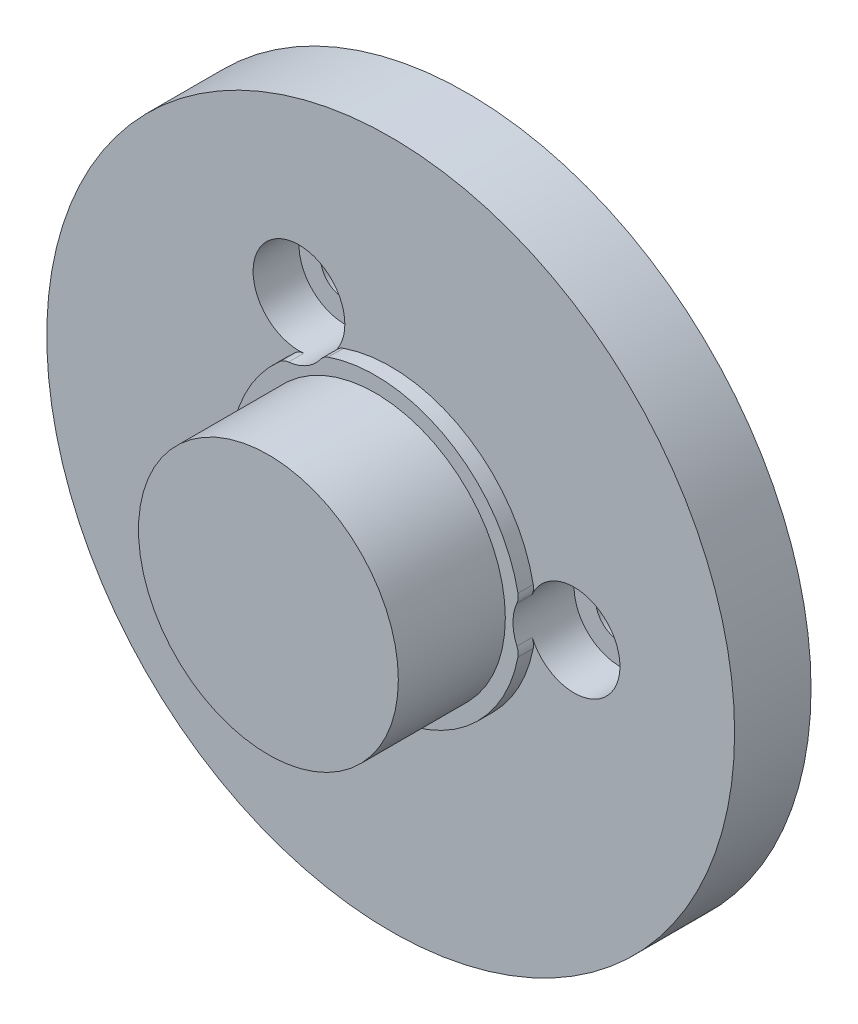
ISO-10303-21;
HEADER;
FILE_DESCRIPTION(('STEP AP214'),'2;1');
FILE_NAME('part.step','',(''),(''),'','','');
FILE_SCHEMA(('AUTOMOTIVE_DESIGN { 1 0 10303 214 1 1 1 1 }'));
ENDSEC;
DATA;
#1=APPLICATION_CONTEXT('core data for automotive mechanical design processes');
#2=APPLICATION_PROTOCOL_DEFINITION('international standard','automotive_design',2000,#1);
#3=PRODUCT_CONTEXT('',#1,'mechanical');
#4=PRODUCT('Part','Part','',(#3));
#5=PRODUCT_RELATED_PRODUCT_CATEGORY('part','',(#4));
#6=PRODUCT_DEFINITION_FORMATION('','',#4);
#7=PRODUCT_DEFINITION_CONTEXT('part definition',#1,'design');
#8=PRODUCT_DEFINITION('design','',#6,#7);
#9=PRODUCT_DEFINITION_SHAPE('','',#8);
#10=(LENGTH_UNIT() NAMED_UNIT(*) SI_UNIT(.MILLI.,.METRE.));
#11=(NAMED_UNIT(*) PLANE_ANGLE_UNIT() SI_UNIT($,.RADIAN.));
#12=(NAMED_UNIT(*) SI_UNIT($,.STERADIAN.) SOLID_ANGLE_UNIT());
#13=UNCERTAINTY_MEASURE_WITH_UNIT(LENGTH_MEASURE(1.E-05),#10,'distance_accuracy_value','');
#14=(GEOMETRIC_REPRESENTATION_CONTEXT(3) GLOBAL_UNCERTAINTY_ASSIGNED_CONTEXT((#13)) GLOBAL_UNIT_ASSIGNED_CONTEXT((#10,
#11,#12)) REPRESENTATION_CONTEXT('',''));
#15=CARTESIAN_POINT('',(0.,0.,0.));
#16=DIRECTION('',(0.,0.,1.));
#17=DIRECTION('',(1.,0.,0.));
#18=AXIS2_PLACEMENT_3D('',#15,#16,#17);
#19=CARTESIAN_POINT('',(-6.00000000000001,10.3923048454133,36.));
#20=DIRECTION('',(0.,0.,-1.));
#21=DIRECTION('',(-1.,0.,0.));
#22=AXIS2_PLACEMENT_3D('',#19,#20,#21);
#23=CYLINDRICAL_SURFACE('',#22,1.6);
#24=CARTESIAN_POINT('',(-6.00000000000001,10.3923048454133,31.));
#25=DIRECTION('',(0.,0.,1.));
#26=DIRECTION('',(1.,0.,0.));
#27=AXIS2_PLACEMENT_3D('',#24,#25,#26);
#28=CIRCLE('',#27,1.6);
#29=CARTESIAN_POINT('',(-4.40000000000001,10.3923048454133,31.));
#30=VERTEX_POINT('',#29);
#31=EDGE_CURVE('E260',#30,#30,#28,.T.);
#32=ORIENTED_EDGE('',*,*,#31,.F.);
#33=EDGE_LOOP('',(#32));
#34=FACE_BOUND('',#33,.T.);
#35=CARTESIAN_POINT('',(-6.00000000000001,10.3923048454133,33.));
#36=DIRECTION('',(0.,0.,1.));
#37=DIRECTION('',(1.,0.,0.));
#38=AXIS2_PLACEMENT_3D('',#35,#36,#37);
#39=CIRCLE('',#38,1.6);
#40=CARTESIAN_POINT('',(-4.40000000000001,10.3923048454133,33.));
#41=VERTEX_POINT('',#40);
#42=EDGE_CURVE('E245',#41,#41,#39,.T.);
#43=ORIENTED_EDGE('',*,*,#42,.T.);
#44=EDGE_LOOP('',(#43));
#45=FACE_BOUND('',#44,.T.);
#46=ADVANCED_FACE('F41',(#34,#45),#23,.F.);
#47=CARTESIAN_POINT('',(-6.,-10.3923048454133,36.));
#48=DIRECTION('',(0.,0.,-1.));
#49=DIRECTION('',(-1.,0.,0.));
#50=AXIS2_PLACEMENT_3D('',#47,#48,#49);
#51=CYLINDRICAL_SURFACE('',#50,1.6);
#52=CARTESIAN_POINT('',(-6.,-10.3923048454133,31.));
#53=DIRECTION('',(0.,0.,1.));
#54=DIRECTION('',(1.,0.,0.));
#55=AXIS2_PLACEMENT_3D('',#52,#53,#54);
#56=CIRCLE('',#55,1.6);
#57=CARTESIAN_POINT('',(-4.4,-10.3923048454133,31.));
#58=VERTEX_POINT('',#57);
#59=EDGE_CURVE('E265',#58,#58,#56,.T.);
#60=ORIENTED_EDGE('',*,*,#59,.F.);
#61=EDGE_LOOP('',(#60));
#62=FACE_BOUND('',#61,.T.);
#63=CARTESIAN_POINT('',(-6.,-10.3923048454133,33.));
#64=DIRECTION('',(0.,0.,1.));
#65=DIRECTION('',(1.,0.,0.));
#66=AXIS2_PLACEMENT_3D('',#63,#64,#65);
#67=CIRCLE('',#66,1.6);
#68=CARTESIAN_POINT('',(-4.4,-10.3923048454133,33.));
#69=VERTEX_POINT('',#68);
#70=EDGE_CURVE('E249',#69,#69,#67,.T.);
#71=ORIENTED_EDGE('',*,*,#70,.T.);
#72=EDGE_LOOP('',(#71));
#73=FACE_BOUND('',#72,.T.);
#74=ADVANCED_FACE('F300',(#62,#73),#51,.F.);
#75=CARTESIAN_POINT('',(12.,0.,36.));
#76=DIRECTION('',(0.,0.,-1.));
#77=DIRECTION('',(-1.,0.,0.));
#78=AXIS2_PLACEMENT_3D('',#75,#76,#77);
#79=CYLINDRICAL_SURFACE('',#78,1.6);
#80=CARTESIAN_POINT('',(12.,0.,31.));
#81=DIRECTION('',(0.,0.,1.));
#82=DIRECTION('',(1.,0.,0.));
#83=AXIS2_PLACEMENT_3D('',#80,#81,#82);
#84=CIRCLE('',#83,1.6);
#85=CARTESIAN_POINT('',(13.6,0.,31.));
#86=VERTEX_POINT('',#85);
#87=EDGE_CURVE('E248',#86,#86,#84,.T.);
#88=ORIENTED_EDGE('',*,*,#87,.F.);
#89=EDGE_LOOP('',(#88));
#90=FACE_BOUND('',#89,.T.);
#91=CARTESIAN_POINT('',(12.,0.,33.));
#92=DIRECTION('',(0.,0.,1.));
#93=DIRECTION('',(1.,0.,0.));
#94=AXIS2_PLACEMENT_3D('',#91,#92,#93);
#95=CIRCLE('',#94,1.6);
#96=CARTESIAN_POINT('',(13.6,0.,33.));
#97=VERTEX_POINT('',#96);
#98=EDGE_CURVE('E252',#97,#97,#95,.T.);
#99=ORIENTED_EDGE('',*,*,#98,.T.);
#100=EDGE_LOOP('',(#99));
#101=FACE_BOUND('',#100,.T.);
#102=ADVANCED_FACE('F307',(#90,#101),#79,.F.);
#103=CARTESIAN_POINT('',(0.,0.,36.));
#104=DIRECTION('',(0.,0.,1.));
#105=DIRECTION('',(1.,0.,0.));
#106=AXIS2_PLACEMENT_3D('',#103,#104,#105);
#107=PLANE('',#106);
#108=CARTESIAN_POINT('',(0.,0.,36.));
#109=DIRECTION('',(0.,0.,1.));
#110=DIRECTION('',(1.,0.,0.));
#111=AXIS2_PLACEMENT_3D('',#108,#109,#110);
#112=CIRCLE('',#111,9.5);
#113=CARTESIAN_POINT('',(-3.09244859102715,-8.98258101615868,36.));
#114=VERTEX_POINT('',#113);
#115=CARTESIAN_POINT('',(9.32536764705882,-1.81315146835243,36.));
#116=VERTEX_POINT('',#115);
#117=EDGE_CURVE('E155',#114,#116,#112,.T.);
#118=ORIENTED_EDGE('',*,*,#117,.F.);
#119=CARTESIAN_POINT('',(-2.7669276867085,-8.0370461723525,36.));
#120=DIRECTION('',(0.,0.,1.));
#121=DIRECTION('',(1.,0.,0.));
#122=AXIS2_PLACEMENT_3D('',#119,#120,#121);
#123=CIRCLE('',#122,1.);
#124=CARTESIAN_POINT('',(-3.57519576503138,-8.62586084061769,36.));
#125=VERTEX_POINT('',#124);
#126=EDGE_CURVE('E227',#114,#125,#123,.F.);
#127=ORIENTED_EDGE('',*,*,#126,.T.);
#128=CARTESIAN_POINT('',(-6.,-10.3923048454133,36.));
#129=DIRECTION('',(0.,0.,1.));
#130=DIRECTION('',(1.,0.,0.));
#131=AXIS2_PLACEMENT_3D('',#128,#129,#130);
#132=CIRCLE('',#131,3.);
#133=CARTESIAN_POINT('',(-5.68261673496862,-7.40914077632856,36.));
#134=VERTEX_POINT('',#133);
#135=EDGE_CURVE('E272',#134,#125,#132,.T.);
#136=ORIENTED_EDGE('',*,*,#135,.F.);
#137=CARTESIAN_POINT('',(-5.57682231329149,-6.41475275330032,36.));
#138=DIRECTION('',(0.,0.,1.));
#139=DIRECTION('',(1.,0.,0.));
#140=AXIS2_PLACEMENT_3D('',#137,#138,#139);
#141=CIRCLE('',#140,1.);
#142=CARTESIAN_POINT('',(-6.23291905603167,-7.16942954780624,36.));
#143=VERTEX_POINT('',#142);
#144=EDGE_CURVE('E225',#134,#143,#141,.F.);
#145=ORIENTED_EDGE('',*,*,#144,.T.);
#146=CARTESIAN_POINT('',(-6.23291905603168,7.16942954780624,36.));
#147=VERTEX_POINT('',#146);
#148=EDGE_CURVE('E152',#147,#143,#112,.T.);
#149=ORIENTED_EDGE('',*,*,#148,.F.);
#150=CARTESIAN_POINT('',(-5.5768223132915,6.41475275330032,36.));
#151=DIRECTION('',(0.,0.,1.));
#152=DIRECTION('',(1.,0.,0.));
#153=AXIS2_PLACEMENT_3D('',#150,#151,#152);
#154=CIRCLE('',#153,1.);
#155=CARTESIAN_POINT('',(-5.68261673496863,7.40914077632856,36.));
#156=VERTEX_POINT('',#155);
#157=EDGE_CURVE('E49',#147,#156,#154,.F.);
#158=ORIENTED_EDGE('',*,*,#157,.T.);
#159=CARTESIAN_POINT('',(-6.00000000000001,10.3923048454133,36.));
#160=DIRECTION('',(0.,0.,1.));
#161=DIRECTION('',(1.,0.,0.));
#162=AXIS2_PLACEMENT_3D('',#159,#160,#161);
#163=CIRCLE('',#162,3.);
#164=CARTESIAN_POINT('',(-3.57519576503138,8.62586084061769,36.));
#165=VERTEX_POINT('',#164);
#166=EDGE_CURVE('E56',#165,#156,#163,.T.);
#167=ORIENTED_EDGE('',*,*,#166,.F.);
#168=CARTESIAN_POINT('',(-2.76692768670851,8.0370461723525,36.));
#169=DIRECTION('',(0.,0.,1.));
#170=DIRECTION('',(1.,0.,0.));
#171=AXIS2_PLACEMENT_3D('',#168,#169,#170);
#172=CIRCLE('',#171,1.);
#173=CARTESIAN_POINT('',(-3.09244859102716,8.98258101615867,36.));
#174=VERTEX_POINT('',#173);
#175=EDGE_CURVE('E11',#165,#174,#172,.F.);
#176=ORIENTED_EDGE('',*,*,#175,.T.);
#177=CARTESIAN_POINT('',(9.32536764705882,1.81315146835243,36.));
#178=VERTEX_POINT('',#177);
#179=EDGE_CURVE('E142',#178,#174,#112,.T.);
#180=ORIENTED_EDGE('',*,*,#179,.F.);
#181=CARTESIAN_POINT('',(8.34375,1.62229341905218,36.));
#182=DIRECTION('',(0.,0.,1.));
#183=DIRECTION('',(1.,0.,0.));
#184=AXIS2_PLACEMENT_3D('',#181,#182,#183);
#185=CIRCLE('',#184,1.);
#186=CARTESIAN_POINT('',(9.2578125,1.21672006428913,36.));
#187=VERTEX_POINT('',#186);
#188=EDGE_CURVE('E128',#178,#187,#185,.F.);
#189=ORIENTED_EDGE('',*,*,#188,.T.);
#190=CARTESIAN_POINT('',(12.,0.,36.));
#191=DIRECTION('',(0.,0.,1.));
#192=DIRECTION('',(1.,0.,0.));
#193=AXIS2_PLACEMENT_3D('',#190,#191,#192);
#194=CIRCLE('',#193,3.);
#195=CARTESIAN_POINT('',(9.2578125,-1.21672006428913,36.));
#196=VERTEX_POINT('',#195);
#197=EDGE_CURVE('E277',#196,#187,#194,.T.);
#198=ORIENTED_EDGE('',*,*,#197,.F.);
#199=CARTESIAN_POINT('',(8.34375,-1.62229341905218,36.));
#200=DIRECTION('',(0.,0.,1.));
#201=DIRECTION('',(1.,0.,0.));
#202=AXIS2_PLACEMENT_3D('',#199,#200,#201);
#203=CIRCLE('',#202,1.);
#204=EDGE_CURVE('E135',#196,#116,#203,.F.);
#205=ORIENTED_EDGE('',*,*,#204,.T.);
#206=EDGE_LOOP('',(#118,#127,#136,#145,#149,#158,#167,#176,#180,#189,#198,#205));
#207=FACE_BOUND('',#206,.T.);
#208=CARTESIAN_POINT('',(0.,0.,36.));
#209=DIRECTION('',(0.,0.,1.));
#210=DIRECTION('',(1.,0.,0.));
#211=AXIS2_PLACEMENT_3D('',#208,#209,#210);
#212=CIRCLE('',#211,22.5);
#213=CARTESIAN_POINT('',(22.5,0.,36.));
#214=VERTEX_POINT('',#213);
#215=EDGE_CURVE('E259',#214,#214,#212,.T.);
#216=ORIENTED_EDGE('',*,*,#215,.T.);
#217=EDGE_LOOP('',(#216));
#218=FACE_BOUND('',#217,.T.);
#219=ADVANCED_FACE('F150',(#207,#218),#107,.T.);
#220=CARTESIAN_POINT('',(0.,0.,31.));
#221=DIRECTION('',(0.,0.,1.));
#222=DIRECTION('',(1.,0.,0.));
#223=AXIS2_PLACEMENT_3D('',#220,#221,#222);
#224=PLANE('',#223);
#225=CARTESIAN_POINT('',(0.,0.,31.));
#226=DIRECTION('',(0.,0.,1.));
#227=DIRECTION('',(1.,0.,0.));
#228=AXIS2_PLACEMENT_3D('',#225,#226,#227);
#229=CIRCLE('',#228,22.5);
#230=CARTESIAN_POINT('',(22.5,0.,31.));
#231=VERTEX_POINT('',#230);
#232=EDGE_CURVE('E256',#231,#231,#229,.T.);
#233=ORIENTED_EDGE('',*,*,#232,.F.);
#234=EDGE_LOOP('',(#233));
#235=FACE_BOUND('',#234,.T.);
#236=ORIENTED_EDGE('',*,*,#31,.T.);
#237=EDGE_LOOP('',(#236));
#238=FACE_BOUND('',#237,.T.);
#239=ORIENTED_EDGE('',*,*,#59,.T.);
#240=EDGE_LOOP('',(#239));
#241=FACE_BOUND('',#240,.T.);
#242=ORIENTED_EDGE('',*,*,#87,.T.);
#243=EDGE_LOOP('',(#242));
#244=FACE_BOUND('',#243,.T.);
#245=ADVANCED_FACE('F316',(#235,#238,#241,#244),#224,.F.);
#246=CARTESIAN_POINT('',(0.,0.,36.));
#247=DIRECTION('',(0.,0.,-1.));
#248=DIRECTION('',(-1.,0.,0.));
#249=AXIS2_PLACEMENT_3D('',#246,#247,#248);
#250=CYLINDRICAL_SURFACE('',#249,22.5);
#251=ORIENTED_EDGE('',*,*,#215,.F.);
#252=EDGE_LOOP('',(#251));
#253=FACE_BOUND('',#252,.T.);
#254=ORIENTED_EDGE('',*,*,#232,.T.);
#255=EDGE_LOOP('',(#254));
#256=FACE_BOUND('',#255,.T.);
#257=ADVANCED_FACE('F319',(#253,#256),#250,.T.);
#258=CARTESIAN_POINT('',(12.,0.,33.));
#259=DIRECTION('',(0.,0.,1.));
#260=DIRECTION('',(1.,0.,0.));
#261=AXIS2_PLACEMENT_3D('',#258,#259,#260);
#262=CYLINDRICAL_SURFACE('',#261,3.);
#263=CARTESIAN_POINT('',(12.,0.,33.));
#264=DIRECTION('',(0.,0.,1.));
#265=DIRECTION('',(1.,0.,0.));
#266=AXIS2_PLACEMENT_3D('',#263,#264,#265);
#267=CIRCLE('',#266,3.);
#268=CARTESIAN_POINT('',(15.,0.,33.));
#269=VERTEX_POINT('',#268);
#270=EDGE_CURVE('E274',#269,#269,#267,.T.);
#271=ORIENTED_EDGE('',*,*,#270,.F.);
#272=EDGE_LOOP('',(#271));
#273=FACE_BOUND('',#272,.T.);
#274=ORIENTED_EDGE('',*,*,#197,.T.);
#275=DIRECTION('',(0.,0.,1.));
#276=VECTOR('',#275,1.);
#277=CARTESIAN_POINT('',(9.2578125,1.21672006428913,33.));
#278=LINE('',#277,#276);
#279=CARTESIAN_POINT('',(9.2578125,1.21672006428913,37.));
#280=VERTEX_POINT('',#279);
#281=EDGE_CURVE('E133',#187,#280,#278,.T.);
#282=ORIENTED_EDGE('',*,*,#281,.T.);
#283=CARTESIAN_POINT('',(12.,0.,37.));
#284=DIRECTION('',(0.,0.,1.));
#285=DIRECTION('',(1.,0.,0.));
#286=AXIS2_PLACEMENT_3D('',#283,#284,#285);
#287=CIRCLE('',#286,3.);
#288=CARTESIAN_POINT('',(9.2578125,-1.21672006428913,37.));
#289=VERTEX_POINT('',#288);
#290=EDGE_CURVE('E162',#289,#280,#287,.F.);
#291=ORIENTED_EDGE('',*,*,#290,.F.);
#292=DIRECTION('',(0.,0.,1.));
#293=VECTOR('',#292,1.);
#294=CARTESIAN_POINT('',(9.2578125,-1.21672006428913,33.));
#295=LINE('',#294,#293);
#296=EDGE_CURVE('E146',#289,#196,#295,.F.);
#297=ORIENTED_EDGE('',*,*,#296,.T.);
#298=EDGE_LOOP('',(#274,#282,#291,#297));
#299=FACE_BOUND('',#298,.T.);
#300=ADVANCED_FACE('F322',(#273,#299),#262,.F.);
#301=CARTESIAN_POINT('',(12.,0.,33.));
#302=DIRECTION('',(0.,0.,1.));
#303=DIRECTION('',(1.,0.,0.));
#304=AXIS2_PLACEMENT_3D('',#301,#302,#303);
#305=PLANE('',#304);
#306=ORIENTED_EDGE('',*,*,#98,.F.);
#307=EDGE_LOOP('',(#306));
#308=FACE_BOUND('',#307,.T.);
#309=ORIENTED_EDGE('',*,*,#270,.T.);
#310=EDGE_LOOP('',(#309));
#311=FACE_BOUND('',#310,.T.);
#312=ADVANCED_FACE('F439',(#308,#311),#305,.T.);
#313=CARTESIAN_POINT('',(-6.,-10.3923048454133,33.));
#314=DIRECTION('',(0.,0.,1.));
#315=DIRECTION('',(1.,0.,0.));
#316=AXIS2_PLACEMENT_3D('',#313,#314,#315);
#317=CYLINDRICAL_SURFACE('',#316,3.);
#318=CARTESIAN_POINT('',(-6.,-10.3923048454133,33.));
#319=DIRECTION('',(0.,0.,1.));
#320=DIRECTION('',(1.,0.,0.));
#321=AXIS2_PLACEMENT_3D('',#318,#319,#320);
#322=CIRCLE('',#321,3.);
#323=CARTESIAN_POINT('',(-3.,-10.3923048454133,33.));
#324=VERTEX_POINT('',#323);
#325=EDGE_CURVE('E178',#324,#324,#322,.T.);
#326=ORIENTED_EDGE('',*,*,#325,.F.);
#327=EDGE_LOOP('',(#326));
#328=FACE_BOUND('',#327,.T.);
#329=CARTESIAN_POINT('',(-6.,-10.3923048454133,37.));
#330=DIRECTION('',(0.,0.,1.));
#331=DIRECTION('',(1.,0.,0.));
#332=AXIS2_PLACEMENT_3D('',#329,#330,#331);
#333=CIRCLE('',#332,3.);
#334=CARTESIAN_POINT('',(-5.68261673496862,-7.40914077632856,37.));
#335=VERTEX_POINT('',#334);
#336=CARTESIAN_POINT('',(-3.57519576503138,-8.62586084061769,37.));
#337=VERTEX_POINT('',#336);
#338=EDGE_CURVE('E179',#335,#337,#333,.F.);
#339=ORIENTED_EDGE('',*,*,#338,.F.);
#340=DIRECTION('',(0.,0.,1.));
#341=VECTOR('',#340,1.);
#342=CARTESIAN_POINT('',(-5.68261673496862,-7.40914077632856,33.));
#343=LINE('',#342,#341);
#344=EDGE_CURVE('E201',#335,#134,#343,.F.);
#345=ORIENTED_EDGE('',*,*,#344,.T.);
#346=ORIENTED_EDGE('',*,*,#135,.T.);
#347=DIRECTION('',(0.,0.,1.));
#348=VECTOR('',#347,1.);
#349=CARTESIAN_POINT('',(-3.57519576503138,-8.62586084061769,33.));
#350=LINE('',#349,#348);
#351=EDGE_CURVE('E215',#125,#337,#350,.T.);
#352=ORIENTED_EDGE('',*,*,#351,.T.);
#353=EDGE_LOOP('',(#339,#345,#346,#352));
#354=FACE_BOUND('',#353,.T.);
#355=ADVANCED_FACE('F295',(#328,#354),#317,.F.);
#356=CARTESIAN_POINT('',(-6.,-10.3923048454133,33.));
#357=DIRECTION('',(0.,0.,1.));
#358=DIRECTION('',(1.,0.,0.));
#359=AXIS2_PLACEMENT_3D('',#356,#357,#358);
#360=PLANE('',#359);
#361=ORIENTED_EDGE('',*,*,#70,.F.);
#362=EDGE_LOOP('',(#361));
#363=FACE_BOUND('',#362,.T.);
#364=ORIENTED_EDGE('',*,*,#325,.T.);
#365=EDGE_LOOP('',(#364));
#366=FACE_BOUND('',#365,.T.);
#367=ADVANCED_FACE('F285',(#363,#366),#360,.T.);
#368=CARTESIAN_POINT('',(-6.00000000000001,10.3923048454133,33.));
#369=DIRECTION('',(0.,0.,1.));
#370=DIRECTION('',(1.,0.,0.));
#371=AXIS2_PLACEMENT_3D('',#368,#369,#370);
#372=CYLINDRICAL_SURFACE('',#371,3.);
#373=CARTESIAN_POINT('',(-6.00000000000001,10.3923048454133,33.));
#374=DIRECTION('',(0.,0.,1.));
#375=DIRECTION('',(1.,0.,0.));
#376=AXIS2_PLACEMENT_3D('',#373,#374,#375);
#377=CIRCLE('',#376,3.);
#378=CARTESIAN_POINT('',(-3.,10.3923048454133,33.));
#379=VERTEX_POINT('',#378);
#380=EDGE_CURVE('E255',#379,#379,#377,.T.);
#381=ORIENTED_EDGE('',*,*,#380,.F.);
#382=EDGE_LOOP('',(#381));
#383=FACE_BOUND('',#382,.T.);
#384=ORIENTED_EDGE('',*,*,#166,.T.);
#385=DIRECTION('',(0.,0.,1.));
#386=VECTOR('',#385,1.);
#387=CARTESIAN_POINT('',(-5.68261673496863,7.40914077632856,33.));
#388=LINE('',#387,#386);
#389=CARTESIAN_POINT('',(-5.68261673496863,7.40914077632856,37.));
#390=VERTEX_POINT('',#389);
#391=EDGE_CURVE('E136',#156,#390,#388,.T.);
#392=ORIENTED_EDGE('',*,*,#391,.T.);
#393=CARTESIAN_POINT('',(-6.00000000000001,10.3923048454133,37.));
#394=DIRECTION('',(0.,0.,1.));
#395=DIRECTION('',(1.,0.,0.));
#396=AXIS2_PLACEMENT_3D('',#393,#394,#395);
#397=CIRCLE('',#396,3.);
#398=CARTESIAN_POINT('',(-3.57519576503138,8.62586084061769,37.));
#399=VERTEX_POINT('',#398);
#400=EDGE_CURVE('E170',#399,#390,#397,.F.);
#401=ORIENTED_EDGE('',*,*,#400,.F.);
#402=DIRECTION('',(0.,0.,1.));
#403=VECTOR('',#402,1.);
#404=CARTESIAN_POINT('',(-3.57519576503138,8.62586084061769,33.));
#405=LINE('',#404,#403);
#406=EDGE_CURVE('E221',#399,#165,#405,.F.);
#407=ORIENTED_EDGE('',*,*,#406,.T.);
#408=EDGE_LOOP('',(#384,#392,#401,#407));
#409=FACE_BOUND('',#408,.T.);
#410=ADVANCED_FACE('F234',(#383,#409),#372,.F.);
#411=CARTESIAN_POINT('',(-6.00000000000001,10.3923048454133,33.));
#412=DIRECTION('',(0.,0.,1.));
#413=DIRECTION('',(1.,0.,0.));
#414=AXIS2_PLACEMENT_3D('',#411,#412,#413);
#415=PLANE('',#414);
#416=ORIENTED_EDGE('',*,*,#42,.F.);
#417=EDGE_LOOP('',(#416));
#418=FACE_BOUND('',#417,.T.);
#419=ORIENTED_EDGE('',*,*,#380,.T.);
#420=EDGE_LOOP('',(#419));
#421=FACE_BOUND('',#420,.T.);
#422=ADVANCED_FACE('F282',(#418,#421),#415,.T.);
#423=CARTESIAN_POINT('',(0.,0.,37.));
#424=DIRECTION('',(0.,0.,-1.));
#425=DIRECTION('',(-1.,0.,0.));
#426=AXIS2_PLACEMENT_3D('',#423,#424,#425);
#427=CYLINDRICAL_SURFACE('',#426,9.5);
#428=CARTESIAN_POINT('',(0.,0.,37.));
#429=DIRECTION('',(0.,0.,1.));
#430=DIRECTION('',(1.,0.,0.));
#431=AXIS2_PLACEMENT_3D('',#428,#429,#430);
#432=CIRCLE('',#431,9.5);
#433=CARTESIAN_POINT('',(9.32536764705882,1.81315146835243,37.));
#434=VERTEX_POINT('',#433);
#435=CARTESIAN_POINT('',(-3.09244859102716,8.98258101615867,37.));
#436=VERTEX_POINT('',#435);
#437=EDGE_CURVE('E145',#434,#436,#432,.T.);
#438=ORIENTED_EDGE('',*,*,#437,.F.);
#439=DIRECTION('',(0.,0.,-1.));
#440=VECTOR('',#439,1.);
#441=CARTESIAN_POINT('',(9.32536764705882,1.81315146835243,37.));
#442=LINE('',#441,#440);
#443=EDGE_CURVE('E132',#434,#178,#442,.T.);
#444=ORIENTED_EDGE('',*,*,#443,.T.);
#445=ORIENTED_EDGE('',*,*,#179,.T.);
#446=DIRECTION('',(0.,0.,-1.));
#447=VECTOR('',#446,1.);
#448=CARTESIAN_POINT('',(-3.09244859102716,8.98258101615867,37.));
#449=LINE('',#448,#447);
#450=EDGE_CURVE('E147',#174,#436,#449,.F.);
#451=ORIENTED_EDGE('',*,*,#450,.T.);
#452=EDGE_LOOP('',(#438,#444,#445,#451));
#453=FACE_BOUND('',#452,.T.);
#454=ADVANCED_FACE('F141',(#453),#427,.T.);
#455=ORIENTED_EDGE('',*,*,#148,.T.);
#456=DIRECTION('',(0.,0.,-1.));
#457=VECTOR('',#456,1.);
#458=CARTESIAN_POINT('',(-6.23291905603167,-7.16942954780624,37.));
#459=LINE('',#458,#457);
#460=CARTESIAN_POINT('',(-6.23291905603167,-7.16942954780624,37.));
#461=VERTEX_POINT('',#460);
#462=EDGE_CURVE('E199',#143,#461,#459,.F.);
#463=ORIENTED_EDGE('',*,*,#462,.T.);
#464=CARTESIAN_POINT('',(-6.23291905603168,7.16942954780624,37.));
#465=VERTEX_POINT('',#464);
#466=EDGE_CURVE('E173',#465,#461,#432,.T.);
#467=ORIENTED_EDGE('',*,*,#466,.F.);
#468=DIRECTION('',(0.,0.,-1.));
#469=VECTOR('',#468,1.);
#470=CARTESIAN_POINT('',(-6.23291905603168,7.16942954780624,37.));
#471=LINE('',#470,#469);
#472=EDGE_CURVE('E218',#465,#147,#471,.T.);
#473=ORIENTED_EDGE('',*,*,#472,.T.);
#474=EDGE_LOOP('',(#455,#463,#467,#473));
#475=FACE_BOUND('',#474,.T.);
#476=ADVANCED_FACE('F409',(#475),#427,.T.);
#477=ORIENTED_EDGE('',*,*,#117,.T.);
#478=DIRECTION('',(0.,0.,-1.));
#479=VECTOR('',#478,1.);
#480=CARTESIAN_POINT('',(9.32536764705882,-1.81315146835243,37.));
#481=LINE('',#480,#479);
#482=CARTESIAN_POINT('',(9.32536764705882,-1.81315146835243,37.));
#483=VERTEX_POINT('',#482);
#484=EDGE_CURVE('E213',#116,#483,#481,.F.);
#485=ORIENTED_EDGE('',*,*,#484,.T.);
#486=CARTESIAN_POINT('',(-3.09244859102715,-8.98258101615868,37.));
#487=VERTEX_POINT('',#486);
#488=EDGE_CURVE('E172',#487,#483,#432,.T.);
#489=ORIENTED_EDGE('',*,*,#488,.F.);
#490=DIRECTION('',(0.,0.,-1.));
#491=VECTOR('',#490,1.);
#492=CARTESIAN_POINT('',(-3.09244859102715,-8.98258101615868,37.));
#493=LINE('',#492,#491);
#494=EDGE_CURVE('E211',#487,#114,#493,.T.);
#495=ORIENTED_EDGE('',*,*,#494,.T.);
#496=EDGE_LOOP('',(#477,#485,#489,#495));
#497=FACE_BOUND('',#496,.T.);
#498=ADVANCED_FACE('F399',(#497),#427,.T.);
#499=CARTESIAN_POINT('',(0.,0.,37.));
#500=DIRECTION('',(0.,0.,1.));
#501=DIRECTION('',(1.,0.,0.));
#502=AXIS2_PLACEMENT_3D('',#499,#500,#501);
#503=PLANE('',#502);
#504=CARTESIAN_POINT('',(0.,0.,37.));
#505=DIRECTION('',(0.,0.,1.));
#506=DIRECTION('',(1.,0.,0.));
#507=AXIS2_PLACEMENT_3D('',#504,#505,#506);
#508=CIRCLE('',#507,8.49999999999795);
#509=CARTESIAN_POINT('',(8.49999999999795,0.,37.));
#510=VERTEX_POINT('',#509);
#511=EDGE_CURVE('E175',#510,#510,#508,.T.);
#512=ORIENTED_EDGE('',*,*,#511,.F.);
#513=EDGE_LOOP('',(#512));
#514=FACE_BOUND('',#513,.T.);
#515=ORIENTED_EDGE('',*,*,#290,.T.);
#516=CARTESIAN_POINT('',(8.34375,1.62229341905218,37.));
#517=DIRECTION('',(0.,0.,1.));
#518=DIRECTION('',(1.,0.,0.));
#519=AXIS2_PLACEMENT_3D('',#516,#517,#518);
#520=CIRCLE('',#519,1.);
#521=EDGE_CURVE('E205',#280,#434,#520,.T.);
#522=ORIENTED_EDGE('',*,*,#521,.T.);
#523=ORIENTED_EDGE('',*,*,#437,.T.);
#524=CARTESIAN_POINT('',(-2.76692768670851,8.0370461723525,37.));
#525=DIRECTION('',(0.,0.,1.));
#526=DIRECTION('',(1.,0.,0.));
#527=AXIS2_PLACEMENT_3D('',#524,#525,#526);
#528=CIRCLE('',#527,1.);
#529=EDGE_CURVE('E237',#436,#399,#528,.T.);
#530=ORIENTED_EDGE('',*,*,#529,.T.);
#531=ORIENTED_EDGE('',*,*,#400,.T.);
#532=CARTESIAN_POINT('',(-5.5768223132915,6.41475275330032,37.));
#533=DIRECTION('',(0.,0.,1.));
#534=DIRECTION('',(1.,0.,0.));
#535=AXIS2_PLACEMENT_3D('',#532,#533,#534);
#536=CIRCLE('',#535,1.);
#537=EDGE_CURVE('E190',#390,#465,#536,.T.);
#538=ORIENTED_EDGE('',*,*,#537,.T.);
#539=ORIENTED_EDGE('',*,*,#466,.T.);
#540=CARTESIAN_POINT('',(-5.57682231329149,-6.41475275330032,37.));
#541=DIRECTION('',(0.,0.,1.));
#542=DIRECTION('',(1.,0.,0.));
#543=AXIS2_PLACEMENT_3D('',#540,#541,#542);
#544=CIRCLE('',#543,1.);
#545=EDGE_CURVE('E188',#461,#335,#544,.T.);
#546=ORIENTED_EDGE('',*,*,#545,.T.);
#547=ORIENTED_EDGE('',*,*,#338,.T.);
#548=CARTESIAN_POINT('',(-2.7669276867085,-8.0370461723525,37.));
#549=DIRECTION('',(0.,0.,1.));
#550=DIRECTION('',(1.,0.,0.));
#551=AXIS2_PLACEMENT_3D('',#548,#549,#550);
#552=CIRCLE('',#551,1.);
#553=EDGE_CURVE('E203',#337,#487,#552,.T.);
#554=ORIENTED_EDGE('',*,*,#553,.T.);
#555=ORIENTED_EDGE('',*,*,#488,.T.);
#556=CARTESIAN_POINT('',(8.34375,-1.62229341905218,37.));
#557=DIRECTION('',(0.,0.,1.));
#558=DIRECTION('',(1.,0.,0.));
#559=AXIS2_PLACEMENT_3D('',#556,#557,#558);
#560=CIRCLE('',#559,1.);
#561=EDGE_CURVE('E202',#483,#289,#560,.T.);
#562=ORIENTED_EDGE('',*,*,#561,.T.);
#563=EDGE_LOOP('',(#515,#522,#523,#530,#531,#538,#539,#546,#547,#554,#555,#562));
#564=FACE_BOUND('',#563,.T.);
#565=ADVANCED_FACE('F187',(#514,#564),#503,.T.);
#566=CARTESIAN_POINT('',(0.,0.,44.));
#567=DIRECTION('',(0.,0.,-1.));
#568=DIRECTION('',(-1.,0.,0.));
#569=AXIS2_PLACEMENT_3D('',#566,#567,#568);
#570=CYLINDRICAL_SURFACE('',#569,8.49999999999795);
#571=CARTESIAN_POINT('',(0.,0.,44.));
#572=DIRECTION('',(0.,0.,1.));
#573=DIRECTION('',(1.,0.,0.));
#574=AXIS2_PLACEMENT_3D('',#571,#572,#573);
#575=CIRCLE('',#574,8.49999999999795);
#576=CARTESIAN_POINT('',(8.49999999999795,0.,44.));
#577=VERTEX_POINT('',#576);
#578=EDGE_CURVE('E153',#577,#577,#575,.T.);
#579=ORIENTED_EDGE('',*,*,#578,.F.);
#580=EDGE_LOOP('',(#579));
#581=FACE_BOUND('',#580,.T.);
#582=ORIENTED_EDGE('',*,*,#511,.T.);
#583=EDGE_LOOP('',(#582));
#584=FACE_BOUND('',#583,.T.);
#585=ADVANCED_FACE('F381',(#581,#584),#570,.T.);
#586=CARTESIAN_POINT('',(0.,0.,44.));
#587=DIRECTION('',(0.,0.,1.));
#588=DIRECTION('',(1.,0.,0.));
#589=AXIS2_PLACEMENT_3D('',#586,#587,#588);
#590=PLANE('',#589);
#591=ORIENTED_EDGE('',*,*,#578,.T.);
#592=EDGE_LOOP('',(#591));
#593=FACE_BOUND('',#592,.T.);
#594=ADVANCED_FACE('F327',(#593),#590,.T.);
#595=CARTESIAN_POINT('',(8.34375,1.62229341905218,33.));
#596=DIRECTION('',(0.,0.,1.));
#597=DIRECTION('',(1.,0.,0.));
#598=AXIS2_PLACEMENT_3D('',#595,#596,#597);
#599=CYLINDRICAL_SURFACE('',#598,1.);
#600=ORIENTED_EDGE('',*,*,#521,.F.);
#601=ORIENTED_EDGE('',*,*,#281,.F.);
#602=ORIENTED_EDGE('',*,*,#188,.F.);
#603=ORIENTED_EDGE('',*,*,#443,.F.);
#604=EDGE_LOOP('',(#600,#601,#602,#603));
#605=FACE_BOUND('',#604,.T.);
#606=ADVANCED_FACE('F131',(#605),#599,.T.);
#607=CARTESIAN_POINT('',(8.34375,-1.62229341905218,37.));
#608=DIRECTION('',(0.,0.,1.));
#609=DIRECTION('',(1.,0.,0.));
#610=AXIS2_PLACEMENT_3D('',#607,#608,#609);
#611=CYLINDRICAL_SURFACE('',#610,1.);
#612=ORIENTED_EDGE('',*,*,#561,.F.);
#613=ORIENTED_EDGE('',*,*,#484,.F.);
#614=ORIENTED_EDGE('',*,*,#204,.F.);
#615=ORIENTED_EDGE('',*,*,#296,.F.);
#616=EDGE_LOOP('',(#612,#613,#614,#615));
#617=FACE_BOUND('',#616,.T.);
#618=ADVANCED_FACE('F326',(#617),#611,.T.);
#619=CARTESIAN_POINT('',(-5.57682231329149,-6.41475275330032,37.));
#620=DIRECTION('',(0.,0.,1.));
#621=DIRECTION('',(1.,0.,0.));
#622=AXIS2_PLACEMENT_3D('',#619,#620,#621);
#623=CYLINDRICAL_SURFACE('',#622,1.);
#624=ORIENTED_EDGE('',*,*,#545,.F.);
#625=ORIENTED_EDGE('',*,*,#462,.F.);
#626=ORIENTED_EDGE('',*,*,#144,.F.);
#627=ORIENTED_EDGE('',*,*,#344,.F.);
#628=EDGE_LOOP('',(#624,#625,#626,#627));
#629=FACE_BOUND('',#628,.T.);
#630=ADVANCED_FACE('F197',(#629),#623,.T.);
#631=CARTESIAN_POINT('',(-2.7669276867085,-8.0370461723525,33.));
#632=DIRECTION('',(0.,0.,1.));
#633=DIRECTION('',(1.,0.,0.));
#634=AXIS2_PLACEMENT_3D('',#631,#632,#633);
#635=CYLINDRICAL_SURFACE('',#634,1.);
#636=ORIENTED_EDGE('',*,*,#553,.F.);
#637=ORIENTED_EDGE('',*,*,#351,.F.);
#638=ORIENTED_EDGE('',*,*,#126,.F.);
#639=ORIENTED_EDGE('',*,*,#494,.F.);
#640=EDGE_LOOP('',(#636,#637,#638,#639));
#641=FACE_BOUND('',#640,.T.);
#642=ADVANCED_FACE('F333',(#641),#635,.T.);
#643=CARTESIAN_POINT('',(-5.5768223132915,6.41475275330032,33.));
#644=DIRECTION('',(0.,0.,1.));
#645=DIRECTION('',(1.,0.,0.));
#646=AXIS2_PLACEMENT_3D('',#643,#644,#645);
#647=CYLINDRICAL_SURFACE('',#646,1.);
#648=ORIENTED_EDGE('',*,*,#537,.F.);
#649=ORIENTED_EDGE('',*,*,#391,.F.);
#650=ORIENTED_EDGE('',*,*,#157,.F.);
#651=ORIENTED_EDGE('',*,*,#472,.F.);
#652=EDGE_LOOP('',(#648,#649,#650,#651));
#653=FACE_BOUND('',#652,.T.);
#654=ADVANCED_FACE('F232',(#653),#647,.T.);
#655=CARTESIAN_POINT('',(-2.76692768670851,8.0370461723525,37.));
#656=DIRECTION('',(0.,0.,1.));
#657=DIRECTION('',(1.,0.,0.));
#658=AXIS2_PLACEMENT_3D('',#655,#656,#657);
#659=CYLINDRICAL_SURFACE('',#658,1.);
#660=ORIENTED_EDGE('',*,*,#529,.F.);
#661=ORIENTED_EDGE('',*,*,#450,.F.);
#662=ORIENTED_EDGE('',*,*,#175,.F.);
#663=ORIENTED_EDGE('',*,*,#406,.F.);
#664=EDGE_LOOP('',(#660,#661,#662,#663));
#665=FACE_BOUND('',#664,.T.);
#666=ADVANCED_FACE('F43',(#665),#659,.T.);
#667=CLOSED_SHELL('',(#46,#74,#102,#219,#245,#257,#300,#312,#355,#367,#410,#422,#454,#476,#498,
#565,#585,#594,#606,#618,#630,#642,#654,#666));
#668=MANIFOLD_SOLID_BREP('B2',#667);
#669=ADVANCED_BREP_SHAPE_REPRESENTATION('',(#18,#668),#14);
#670=SHAPE_DEFINITION_REPRESENTATION(#9,#669);
ENDSEC;
END-ISO-10303-21;
